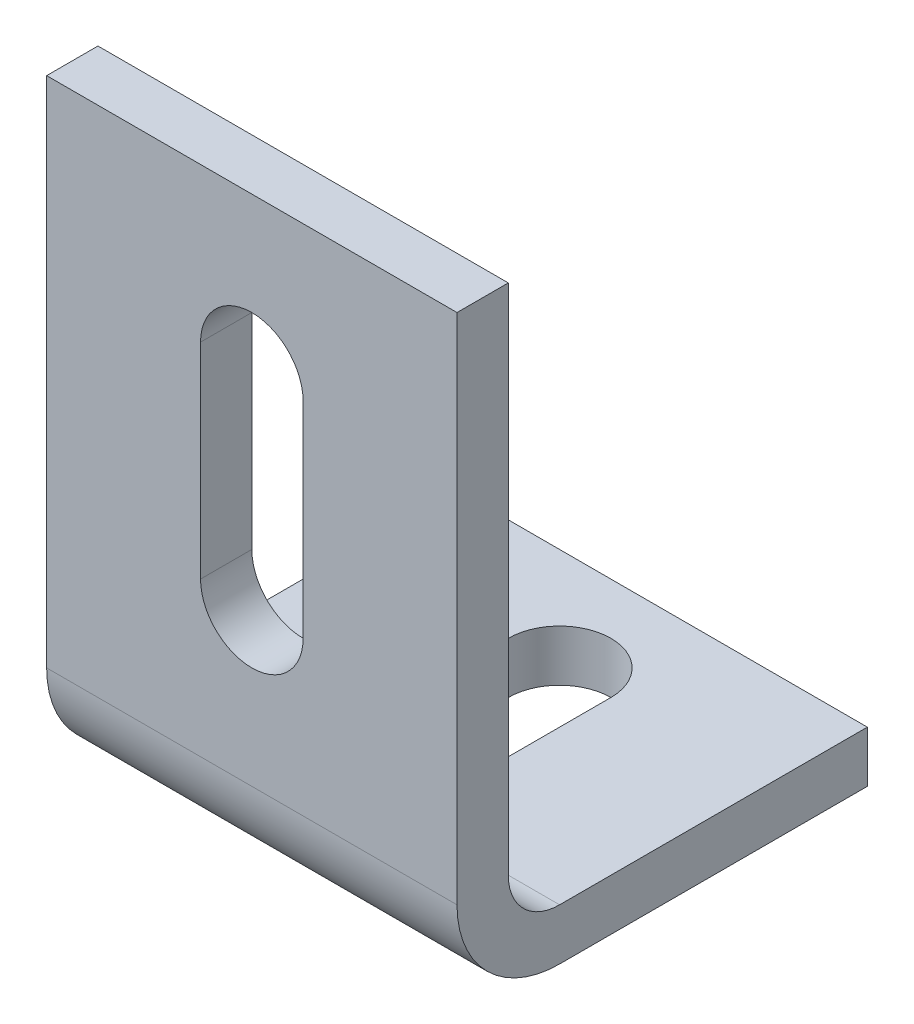
ISO-10303-21;
HEADER;
FILE_DESCRIPTION(('STEP AP214'),'2;1');
FILE_NAME('part.step','',(''),(''),'','','');
FILE_SCHEMA(('AUTOMOTIVE_DESIGN { 1 0 10303 214 1 1 1 1 }'));
ENDSEC;
DATA;
#1=APPLICATION_CONTEXT('core data for automotive mechanical design processes');
#2=APPLICATION_PROTOCOL_DEFINITION('international standard','automotive_design',2000,#1);
#3=PRODUCT_CONTEXT('',#1,'mechanical');
#4=PRODUCT('Part','Part','',(#3));
#5=PRODUCT_RELATED_PRODUCT_CATEGORY('part','',(#4));
#6=PRODUCT_DEFINITION_FORMATION('','',#4);
#7=PRODUCT_DEFINITION_CONTEXT('part definition',#1,'design');
#8=PRODUCT_DEFINITION('design','',#6,#7);
#9=PRODUCT_DEFINITION_SHAPE('','',#8);
#10=(LENGTH_UNIT() NAMED_UNIT(*) SI_UNIT(.MILLI.,.METRE.));
#11=(NAMED_UNIT(*) PLANE_ANGLE_UNIT() SI_UNIT($,.RADIAN.));
#12=(NAMED_UNIT(*) SI_UNIT($,.STERADIAN.) SOLID_ANGLE_UNIT());
#13=UNCERTAINTY_MEASURE_WITH_UNIT(LENGTH_MEASURE(1.E-05),#10,'distance_accuracy_value','');
#14=(GEOMETRIC_REPRESENTATION_CONTEXT(3) GLOBAL_UNCERTAINTY_ASSIGNED_CONTEXT((#13)) GLOBAL_UNIT_ASSIGNED_CONTEXT((#10,
#11,#12)) REPRESENTATION_CONTEXT('',''));
#15=CARTESIAN_POINT('',(0.,0.,0.));
#16=DIRECTION('',(0.,0.,1.));
#17=DIRECTION('',(1.,0.,0.));
#18=AXIS2_PLACEMENT_3D('',#15,#16,#17);
#19=CARTESIAN_POINT('',(12.7,34.925,0.));
#20=DIRECTION('',(0.,0.,-1.));
#21=DIRECTION('',(0.,1.,0.));
#22=AXIS2_PLACEMENT_3D('',#19,#20,#21);
#23=PLANE('',#22);
#24=DIRECTION('',(0.,-1.,0.));
#25=VECTOR('',#24,1.);
#26=CARTESIAN_POINT('',(-12.7,34.925,0.));
#27=LINE('',#26,#25);
#28=CARTESIAN_POINT('',(-12.7,34.925,0.));
#29=VERTEX_POINT('',#28);
#30=CARTESIAN_POINT('',(-12.7,3.175,0.));
#31=VERTEX_POINT('',#30);
#32=EDGE_CURVE('E245',#29,#31,#27,.T.);
#33=ORIENTED_EDGE('',*,*,#32,.F.);
#34=DIRECTION('',(-1.,0.,0.));
#35=VECTOR('',#34,1.);
#36=CARTESIAN_POINT('',(12.7,34.925,0.));
#37=LINE('',#36,#35);
#38=CARTESIAN_POINT('',(12.7,34.925,0.));
#39=VERTEX_POINT('',#38);
#40=EDGE_CURVE('E261',#39,#29,#37,.T.);
#41=ORIENTED_EDGE('',*,*,#40,.F.);
#42=DIRECTION('',(0.,-1.,0.));
#43=VECTOR('',#42,1.);
#44=CARTESIAN_POINT('',(12.7,34.925,0.));
#45=LINE('',#44,#43);
#46=CARTESIAN_POINT('',(12.7,3.175,0.));
#47=VERTEX_POINT('',#46);
#48=EDGE_CURVE('E223',#39,#47,#45,.T.);
#49=ORIENTED_EDGE('',*,*,#48,.T.);
#50=DIRECTION('',(-1.,0.,0.));
#51=VECTOR('',#50,1.);
#52=CARTESIAN_POINT('',(12.7,3.175,0.));
#53=LINE('',#52,#51);
#54=EDGE_CURVE('E263',#47,#31,#53,.T.);
#55=ORIENTED_EDGE('',*,*,#54,.T.);
#56=EDGE_LOOP('',(#33,#41,#49,#55));
#57=FACE_BOUND('',#56,.T.);
#58=DIRECTION('',(0.,1.,0.));
#59=VECTOR('',#58,1.);
#60=CARTESIAN_POINT('',(3.175,25.4,0.));
#61=LINE('',#60,#59);
#62=CARTESIAN_POINT('',(3.17500000000001,12.7,0.));
#63=VERTEX_POINT('',#62);
#64=CARTESIAN_POINT('',(3.175,25.4,0.));
#65=VERTEX_POINT('',#64);
#66=EDGE_CURVE('E183',#63,#65,#61,.T.);
#67=ORIENTED_EDGE('',*,*,#66,.T.);
#68=CARTESIAN_POINT('',(0.,25.4,0.));
#69=DIRECTION('',(0.,0.,1.));
#70=DIRECTION('',(1.,0.,0.));
#71=AXIS2_PLACEMENT_3D('',#68,#69,#70);
#72=CIRCLE('',#71,3.175);
#73=CARTESIAN_POINT('',(-3.175,25.4,0.));
#74=VERTEX_POINT('',#73);
#75=EDGE_CURVE('E176',#65,#74,#72,.T.);
#76=ORIENTED_EDGE('',*,*,#75,.T.);
#77=DIRECTION('',(0.,-1.,0.));
#78=VECTOR('',#77,1.);
#79=CARTESIAN_POINT('',(-3.175,25.4,0.));
#80=LINE('',#79,#78);
#81=CARTESIAN_POINT('',(-3.175,12.7,0.));
#82=VERTEX_POINT('',#81);
#83=EDGE_CURVE('E193',#74,#82,#80,.T.);
#84=ORIENTED_EDGE('',*,*,#83,.T.);
#85=CARTESIAN_POINT('',(0.,12.7,0.));
#86=DIRECTION('',(0.,0.,1.));
#87=DIRECTION('',(1.,0.,0.));
#88=AXIS2_PLACEMENT_3D('',#85,#86,#87);
#89=CIRCLE('',#88,3.175);
#90=EDGE_CURVE('E196',#82,#63,#89,.T.);
#91=ORIENTED_EDGE('',*,*,#90,.T.);
#92=EDGE_LOOP('',(#67,#76,#84,#91));
#93=FACE_BOUND('',#92,.T.);
#94=ADVANCED_FACE('F32',(#57,#93),#23,.T.);
#95=CARTESIAN_POINT('',(12.7,34.925,3.17500000000001));
#96=DIRECTION('',(0.,0.,-1.));
#97=DIRECTION('',(0.,1.,0.));
#98=AXIS2_PLACEMENT_3D('',#95,#96,#97);
#99=PLANE('',#98);
#100=DIRECTION('',(0.,-1.,0.));
#101=VECTOR('',#100,1.);
#102=CARTESIAN_POINT('',(-12.7,34.925,3.17500000000001));
#103=LINE('',#102,#101);
#104=CARTESIAN_POINT('',(-12.7,34.925,3.17500000000001));
#105=VERTEX_POINT('',#104);
#106=CARTESIAN_POINT('',(-12.7,3.175,3.175));
#107=VERTEX_POINT('',#106);
#108=EDGE_CURVE('E251',#105,#107,#103,.T.);
#109=ORIENTED_EDGE('',*,*,#108,.T.);
#110=DIRECTION('',(-1.,0.,0.));
#111=VECTOR('',#110,1.);
#112=CARTESIAN_POINT('',(12.7,3.175,3.175));
#113=LINE('',#112,#111);
#114=CARTESIAN_POINT('',(12.7,3.175,3.175));
#115=VERTEX_POINT('',#114);
#116=EDGE_CURVE('E256',#115,#107,#113,.T.);
#117=ORIENTED_EDGE('',*,*,#116,.F.);
#118=DIRECTION('',(0.,-1.,0.));
#119=VECTOR('',#118,1.);
#120=CARTESIAN_POINT('',(12.7,34.925,3.17500000000001));
#121=LINE('',#120,#119);
#122=CARTESIAN_POINT('',(12.7,34.925,3.17500000000001));
#123=VERTEX_POINT('',#122);
#124=EDGE_CURVE('E229',#123,#115,#121,.T.);
#125=ORIENTED_EDGE('',*,*,#124,.F.);
#126=DIRECTION('',(-1.,0.,0.));
#127=VECTOR('',#126,1.);
#128=CARTESIAN_POINT('',(12.7,34.925,3.17500000000001));
#129=LINE('',#128,#127);
#130=EDGE_CURVE('E259',#123,#105,#129,.T.);
#131=ORIENTED_EDGE('',*,*,#130,.T.);
#132=EDGE_LOOP('',(#109,#117,#125,#131));
#133=FACE_BOUND('',#132,.T.);
#134=CARTESIAN_POINT('',(0.,25.4,3.17500000000001));
#135=DIRECTION('',(0.,0.,1.));
#136=DIRECTION('',(1.,0.,0.));
#137=AXIS2_PLACEMENT_3D('',#134,#135,#136);
#138=CIRCLE('',#137,3.175);
#139=CARTESIAN_POINT('',(3.175,25.4,3.17500000000001));
#140=VERTEX_POINT('',#139);
#141=CARTESIAN_POINT('',(-3.175,25.4,3.17500000000001));
#142=VERTEX_POINT('',#141);
#143=EDGE_CURVE('E180',#140,#142,#138,.T.);
#144=ORIENTED_EDGE('',*,*,#143,.F.);
#145=DIRECTION('',(0.,1.,0.));
#146=VECTOR('',#145,1.);
#147=CARTESIAN_POINT('',(3.175,25.4,3.17500000000001));
#148=LINE('',#147,#146);
#149=CARTESIAN_POINT('',(3.17500000000001,12.7,3.175));
#150=VERTEX_POINT('',#149);
#151=EDGE_CURVE('E188',#150,#140,#148,.T.);
#152=ORIENTED_EDGE('',*,*,#151,.F.);
#153=CARTESIAN_POINT('',(0.,12.7,3.17500000000001));
#154=DIRECTION('',(0.,0.,1.));
#155=DIRECTION('',(1.,0.,0.));
#156=AXIS2_PLACEMENT_3D('',#153,#154,#155);
#157=CIRCLE('',#156,3.175);
#158=CARTESIAN_POINT('',(-3.175,12.7,3.17500000000001));
#159=VERTEX_POINT('',#158);
#160=EDGE_CURVE('E185',#159,#150,#157,.T.);
#161=ORIENTED_EDGE('',*,*,#160,.F.);
#162=DIRECTION('',(0.,-1.,0.));
#163=VECTOR('',#162,1.);
#164=CARTESIAN_POINT('',(-3.175,25.4,3.17500000000001));
#165=LINE('',#164,#163);
#166=EDGE_CURVE('E182',#142,#159,#165,.T.);
#167=ORIENTED_EDGE('',*,*,#166,.F.);
#168=EDGE_LOOP('',(#144,#152,#161,#167));
#169=FACE_BOUND('',#168,.T.);
#170=ADVANCED_FACE('F297',(#133,#169),#99,.F.);
#171=CARTESIAN_POINT('',(12.7,-3.175,-3.175));
#172=DIRECTION('',(0.,1.,0.));
#173=DIRECTION('',(0.,0.,1.));
#174=AXIS2_PLACEMENT_3D('',#171,#172,#173);
#175=PLANE('',#174);
#176=DIRECTION('',(0.,0.,-1.));
#177=VECTOR('',#176,1.);
#178=CARTESIAN_POINT('',(3.175,-3.175,-15.875));
#179=LINE('',#178,#177);
#180=CARTESIAN_POINT('',(3.175,-3.175,-9.52499999999999));
#181=VERTEX_POINT('',#180);
#182=CARTESIAN_POINT('',(3.175,-3.175,-15.875));
#183=VERTEX_POINT('',#182);
#184=EDGE_CURVE('E152',#181,#183,#179,.T.);
#185=ORIENTED_EDGE('',*,*,#184,.T.);
#186=CARTESIAN_POINT('',(0.,-3.175,-15.875));
#187=DIRECTION('',(0.,1.,0.));
#188=DIRECTION('',(0.,0.,1.));
#189=AXIS2_PLACEMENT_3D('',#186,#187,#188);
#190=CIRCLE('',#189,3.175);
#191=CARTESIAN_POINT('',(-3.175,-3.175,-15.875));
#192=VERTEX_POINT('',#191);
#193=EDGE_CURVE('E146',#183,#192,#190,.T.);
#194=ORIENTED_EDGE('',*,*,#193,.T.);
#195=DIRECTION('',(0.,0.,1.));
#196=VECTOR('',#195,1.);
#197=CARTESIAN_POINT('',(-3.175,-3.175,-15.875));
#198=LINE('',#197,#196);
#199=CARTESIAN_POINT('',(-3.175,-3.175,-9.52499999999999));
#200=VERTEX_POINT('',#199);
#201=EDGE_CURVE('E155',#192,#200,#198,.T.);
#202=ORIENTED_EDGE('',*,*,#201,.T.);
#203=CARTESIAN_POINT('',(0.,-3.175,-9.52499999999999));
#204=DIRECTION('',(0.,1.,0.));
#205=DIRECTION('',(0.,0.,1.));
#206=AXIS2_PLACEMENT_3D('',#203,#204,#205);
#207=CIRCLE('',#206,3.175);
#208=EDGE_CURVE('E47',#200,#181,#207,.T.);
#209=ORIENTED_EDGE('',*,*,#208,.T.);
#210=EDGE_LOOP('',(#185,#194,#202,#209));
#211=FACE_BOUND('',#210,.T.);
#212=DIRECTION('',(0.,0.,-1.));
#213=VECTOR('',#212,1.);
#214=CARTESIAN_POINT('',(-12.7,-3.175,-3.175));
#215=LINE('',#214,#213);
#216=CARTESIAN_POINT('',(-12.7,-3.175,-3.175));
#217=VERTEX_POINT('',#216);
#218=CARTESIAN_POINT('',(-12.7,-3.175,-22.225));
#219=VERTEX_POINT('',#218);
#220=EDGE_CURVE('E210',#217,#219,#215,.T.);
#221=ORIENTED_EDGE('',*,*,#220,.T.);
#222=DIRECTION('',(-1.,0.,0.));
#223=VECTOR('',#222,1.);
#224=CARTESIAN_POINT('',(12.7,-3.175,-22.225));
#225=LINE('',#224,#223);
#226=CARTESIAN_POINT('',(12.7,-3.175,-22.225));
#227=VERTEX_POINT('',#226);
#228=EDGE_CURVE('E11',#227,#219,#225,.T.);
#229=ORIENTED_EDGE('',*,*,#228,.F.);
#230=DIRECTION('',(0.,0.,-1.));
#231=VECTOR('',#230,1.);
#232=CARTESIAN_POINT('',(12.7,-3.175,-3.175));
#233=LINE('',#232,#231);
#234=CARTESIAN_POINT('',(12.7,-3.175,-3.175));
#235=VERTEX_POINT('',#234);
#236=EDGE_CURVE('E211',#235,#227,#233,.T.);
#237=ORIENTED_EDGE('',*,*,#236,.F.);
#238=DIRECTION('',(-1.,0.,0.));
#239=VECTOR('',#238,1.);
#240=CARTESIAN_POINT('',(12.7,-3.175,-3.175));
#241=LINE('',#240,#239);
#242=EDGE_CURVE('E233',#235,#217,#241,.T.);
#243=ORIENTED_EDGE('',*,*,#242,.T.);
#244=EDGE_LOOP('',(#221,#229,#237,#243));
#245=FACE_BOUND('',#244,.T.);
#246=ADVANCED_FACE('F34',(#211,#245),#175,.F.);
#247=CARTESIAN_POINT('',(12.7,0.,-22.225));
#248=DIRECTION('',(0.,0.,-1.));
#249=DIRECTION('',(-1.,0.,0.));
#250=AXIS2_PLACEMENT_3D('',#247,#248,#249);
#251=PLANE('',#250);
#252=DIRECTION('',(0.,-1.,0.));
#253=VECTOR('',#252,1.);
#254=CARTESIAN_POINT('',(-12.7,0.,-22.225));
#255=LINE('',#254,#253);
#256=CARTESIAN_POINT('',(-12.7,0.,-22.225));
#257=VERTEX_POINT('',#256);
#258=EDGE_CURVE('E236',#257,#219,#255,.T.);
#259=ORIENTED_EDGE('',*,*,#258,.F.);
#260=DIRECTION('',(-1.,0.,0.));
#261=VECTOR('',#260,1.);
#262=CARTESIAN_POINT('',(12.7,0.,-22.225));
#263=LINE('',#262,#261);
#264=CARTESIAN_POINT('',(12.7,0.,-22.225));
#265=VERTEX_POINT('',#264);
#266=EDGE_CURVE('E40',#265,#257,#263,.T.);
#267=ORIENTED_EDGE('',*,*,#266,.F.);
#268=DIRECTION('',(0.,-1.,0.));
#269=VECTOR('',#268,1.);
#270=CARTESIAN_POINT('',(12.7,0.,-22.225));
#271=LINE('',#270,#269);
#272=EDGE_CURVE('E213',#265,#227,#271,.T.);
#273=ORIENTED_EDGE('',*,*,#272,.T.);
#274=ORIENTED_EDGE('',*,*,#228,.T.);
#275=EDGE_LOOP('',(#259,#267,#273,#274));
#276=FACE_BOUND('',#275,.T.);
#277=ADVANCED_FACE('F273',(#276),#251,.T.);
#278=CARTESIAN_POINT('',(12.7,0.,-3.175));
#279=DIRECTION('',(0.,1.,0.));
#280=DIRECTION('',(0.,0.,1.));
#281=AXIS2_PLACEMENT_3D('',#278,#279,#280);
#282=PLANE('',#281);
#283=CARTESIAN_POINT('',(0.,0.,-15.875));
#284=DIRECTION('',(0.,1.,0.));
#285=DIRECTION('',(0.,0.,1.));
#286=AXIS2_PLACEMENT_3D('',#283,#284,#285);
#287=CIRCLE('',#286,3.175);
#288=CARTESIAN_POINT('',(3.175,0.,-15.875));
#289=VERTEX_POINT('',#288);
#290=CARTESIAN_POINT('',(-3.175,0.,-15.875));
#291=VERTEX_POINT('',#290);
#292=EDGE_CURVE('E55',#289,#291,#287,.T.);
#293=ORIENTED_EDGE('',*,*,#292,.F.);
#294=DIRECTION('',(0.,0.,-1.));
#295=VECTOR('',#294,1.);
#296=CARTESIAN_POINT('',(3.175,0.,-15.875));
#297=LINE('',#296,#295);
#298=CARTESIAN_POINT('',(3.175,0.,-9.52499999999999));
#299=VERTEX_POINT('',#298);
#300=EDGE_CURVE('E161',#299,#289,#297,.T.);
#301=ORIENTED_EDGE('',*,*,#300,.F.);
#302=CARTESIAN_POINT('',(0.,0.,-9.52499999999999));
#303=DIRECTION('',(0.,1.,0.));
#304=DIRECTION('',(0.,0.,1.));
#305=AXIS2_PLACEMENT_3D('',#302,#303,#304);
#306=CIRCLE('',#305,3.175);
#307=CARTESIAN_POINT('',(-3.17499999999999,0.,-9.52499999999999));
#308=VERTEX_POINT('',#307);
#309=EDGE_CURVE('E164',#308,#299,#306,.T.);
#310=ORIENTED_EDGE('',*,*,#309,.F.);
#311=DIRECTION('',(0.,0.,1.));
#312=VECTOR('',#311,1.);
#313=CARTESIAN_POINT('',(-3.175,0.,-15.875));
#314=LINE('',#313,#312);
#315=EDGE_CURVE('E170',#291,#308,#314,.T.);
#316=ORIENTED_EDGE('',*,*,#315,.F.);
#317=EDGE_LOOP('',(#293,#301,#310,#316));
#318=FACE_BOUND('',#317,.T.);
#319=DIRECTION('',(0.,0.,-1.));
#320=VECTOR('',#319,1.);
#321=CARTESIAN_POINT('',(-12.7,0.,-3.175));
#322=LINE('',#321,#320);
#323=CARTESIAN_POINT('',(-12.7,0.,-3.175));
#324=VERTEX_POINT('',#323);
#325=EDGE_CURVE('E239',#324,#257,#322,.T.);
#326=ORIENTED_EDGE('',*,*,#325,.F.);
#327=DIRECTION('',(-1.,0.,0.));
#328=VECTOR('',#327,1.);
#329=CARTESIAN_POINT('',(12.7,0.,-3.175));
#330=LINE('',#329,#328);
#331=CARTESIAN_POINT('',(12.7,0.,-3.175));
#332=VERTEX_POINT('',#331);
#333=EDGE_CURVE('E265',#332,#324,#330,.T.);
#334=ORIENTED_EDGE('',*,*,#333,.F.);
#335=DIRECTION('',(0.,0.,-1.));
#336=VECTOR('',#335,1.);
#337=CARTESIAN_POINT('',(12.7,0.,-3.175));
#338=LINE('',#337,#336);
#339=EDGE_CURVE('E217',#332,#265,#338,.T.);
#340=ORIENTED_EDGE('',*,*,#339,.T.);
#341=ORIENTED_EDGE('',*,*,#266,.T.);
#342=EDGE_LOOP('',(#326,#334,#340,#341));
#343=FACE_BOUND('',#342,.T.);
#344=ADVANCED_FACE('F269',(#318,#343),#282,.T.);
#345=CARTESIAN_POINT('',(12.7,3.175,-3.175));
#346=DIRECTION('',(-1.,0.,0.));
#347=DIRECTION('',(0.,0.,1.));
#348=AXIS2_PLACEMENT_3D('',#345,#346,#347);
#349=CYLINDRICAL_SURFACE('',#348,3.175);
#350=CARTESIAN_POINT('',(-12.7,3.175,-3.175));
#351=DIRECTION('',(1.,0.,0.));
#352=DIRECTION('',(0.,0.,-1.));
#353=AXIS2_PLACEMENT_3D('',#350,#351,#352);
#354=CIRCLE('',#353,3.175);
#355=EDGE_CURVE('E242',#31,#324,#354,.T.);
#356=ORIENTED_EDGE('',*,*,#355,.F.);
#357=ORIENTED_EDGE('',*,*,#54,.F.);
#358=CARTESIAN_POINT('',(12.7,3.175,-3.175));
#359=DIRECTION('',(1.,0.,0.));
#360=DIRECTION('',(0.,0.,-1.));
#361=AXIS2_PLACEMENT_3D('',#358,#359,#360);
#362=CIRCLE('',#361,3.175);
#363=EDGE_CURVE('E220',#47,#332,#362,.T.);
#364=ORIENTED_EDGE('',*,*,#363,.T.);
#365=ORIENTED_EDGE('',*,*,#333,.T.);
#366=EDGE_LOOP('',(#356,#357,#364,#365));
#367=FACE_BOUND('',#366,.T.);
#368=ADVANCED_FACE('F281',(#367),#349,.F.);
#369=CARTESIAN_POINT('',(12.7,34.925,3.17500000000001));
#370=DIRECTION('',(0.,1.,0.));
#371=DIRECTION('',(0.,0.,1.));
#372=AXIS2_PLACEMENT_3D('',#369,#370,#371);
#373=PLANE('',#372);
#374=DIRECTION('',(0.,0.,-1.));
#375=VECTOR('',#374,1.);
#376=CARTESIAN_POINT('',(-12.7,34.925,3.17500000000001));
#377=LINE('',#376,#375);
#378=EDGE_CURVE('E248',#105,#29,#377,.T.);
#379=ORIENTED_EDGE('',*,*,#378,.F.);
#380=ORIENTED_EDGE('',*,*,#130,.F.);
#381=DIRECTION('',(0.,0.,-1.));
#382=VECTOR('',#381,1.);
#383=CARTESIAN_POINT('',(12.7,34.925,3.17500000000001));
#384=LINE('',#383,#382);
#385=EDGE_CURVE('E226',#123,#39,#384,.T.);
#386=ORIENTED_EDGE('',*,*,#385,.T.);
#387=ORIENTED_EDGE('',*,*,#40,.T.);
#388=EDGE_LOOP('',(#379,#380,#386,#387));
#389=FACE_BOUND('',#388,.T.);
#390=ADVANCED_FACE('F301',(#389),#373,.T.);
#391=CARTESIAN_POINT('',(12.7,3.175,-3.175));
#392=DIRECTION('',(-1.,0.,0.));
#393=DIRECTION('',(0.,0.,1.));
#394=AXIS2_PLACEMENT_3D('',#391,#392,#393);
#395=CYLINDRICAL_SURFACE('',#394,6.35);
#396=CARTESIAN_POINT('',(-12.7,3.175,-3.175));
#397=DIRECTION('',(1.,0.,0.));
#398=DIRECTION('',(0.,0.,-1.));
#399=AXIS2_PLACEMENT_3D('',#396,#397,#398);
#400=CIRCLE('',#399,6.35);
#401=EDGE_CURVE('E214',#107,#217,#400,.T.);
#402=ORIENTED_EDGE('',*,*,#401,.T.);
#403=ORIENTED_EDGE('',*,*,#242,.F.);
#404=CARTESIAN_POINT('',(12.7,3.175,-3.175));
#405=DIRECTION('',(1.,0.,0.));
#406=DIRECTION('',(0.,0.,-1.));
#407=AXIS2_PLACEMENT_3D('',#404,#405,#406);
#408=CIRCLE('',#407,6.35);
#409=EDGE_CURVE('E231',#115,#235,#408,.T.);
#410=ORIENTED_EDGE('',*,*,#409,.F.);
#411=ORIENTED_EDGE('',*,*,#116,.T.);
#412=EDGE_LOOP('',(#402,#403,#410,#411));
#413=FACE_BOUND('',#412,.T.);
#414=ADVANCED_FACE('F293',(#413),#395,.T.);
#415=CARTESIAN_POINT('',(12.7,3.175,-3.175));
#416=DIRECTION('',(1.,0.,0.));
#417=DIRECTION('',(0.,0.,-1.));
#418=AXIS2_PLACEMENT_3D('',#415,#416,#417);
#419=PLANE('',#418);
#420=ORIENTED_EDGE('',*,*,#236,.T.);
#421=ORIENTED_EDGE('',*,*,#272,.F.);
#422=ORIENTED_EDGE('',*,*,#339,.F.);
#423=ORIENTED_EDGE('',*,*,#363,.F.);
#424=ORIENTED_EDGE('',*,*,#48,.F.);
#425=ORIENTED_EDGE('',*,*,#385,.F.);
#426=ORIENTED_EDGE('',*,*,#124,.T.);
#427=ORIENTED_EDGE('',*,*,#409,.T.);
#428=EDGE_LOOP('',(#420,#421,#422,#423,#424,#425,#426,#427));
#429=FACE_BOUND('',#428,.T.);
#430=ADVANCED_FACE('F284',(#429),#419,.T.);
#431=CARTESIAN_POINT('',(-12.7,3.175,-3.175));
#432=DIRECTION('',(1.,0.,0.));
#433=DIRECTION('',(0.,0.,-1.));
#434=AXIS2_PLACEMENT_3D('',#431,#432,#433);
#435=PLANE('',#434);
#436=ORIENTED_EDGE('',*,*,#220,.F.);
#437=ORIENTED_EDGE('',*,*,#401,.F.);
#438=ORIENTED_EDGE('',*,*,#108,.F.);
#439=ORIENTED_EDGE('',*,*,#378,.T.);
#440=ORIENTED_EDGE('',*,*,#32,.T.);
#441=ORIENTED_EDGE('',*,*,#355,.T.);
#442=ORIENTED_EDGE('',*,*,#325,.T.);
#443=ORIENTED_EDGE('',*,*,#258,.T.);
#444=EDGE_LOOP('',(#436,#437,#438,#439,#440,#441,#442,#443));
#445=FACE_BOUND('',#444,.T.);
#446=ADVANCED_FACE('F277',(#445),#435,.F.);
#447=CARTESIAN_POINT('',(0.,25.4,3.17500000000001));
#448=DIRECTION('',(0.,0.,-1.));
#449=DIRECTION('',(-1.,0.,0.));
#450=AXIS2_PLACEMENT_3D('',#447,#448,#449);
#451=CYLINDRICAL_SURFACE('',#450,3.175);
#452=ORIENTED_EDGE('',*,*,#75,.F.);
#453=DIRECTION('',(0.,0.,-1.));
#454=VECTOR('',#453,1.);
#455=CARTESIAN_POINT('',(3.175,25.4,3.17500000000001));
#456=LINE('',#455,#454);
#457=EDGE_CURVE('E190',#140,#65,#456,.T.);
#458=ORIENTED_EDGE('',*,*,#457,.F.);
#459=ORIENTED_EDGE('',*,*,#143,.T.);
#460=DIRECTION('',(0.,0.,-1.));
#461=VECTOR('',#460,1.);
#462=CARTESIAN_POINT('',(-3.175,25.4,3.17500000000001));
#463=LINE('',#462,#461);
#464=EDGE_CURVE('E207',#142,#74,#463,.T.);
#465=ORIENTED_EDGE('',*,*,#464,.T.);
#466=EDGE_LOOP('',(#452,#458,#459,#465));
#467=FACE_BOUND('',#466,.T.);
#468=ADVANCED_FACE('F314',(#467),#451,.F.);
#469=CARTESIAN_POINT('',(-3.175,25.4,3.17500000000001));
#470=DIRECTION('',(1.,0.,0.));
#471=DIRECTION('',(0.,1.,0.));
#472=AXIS2_PLACEMENT_3D('',#469,#470,#471);
#473=PLANE('',#472);
#474=ORIENTED_EDGE('',*,*,#83,.F.);
#475=ORIENTED_EDGE('',*,*,#464,.F.);
#476=ORIENTED_EDGE('',*,*,#166,.T.);
#477=DIRECTION('',(0.,0.,-1.));
#478=VECTOR('',#477,1.);
#479=CARTESIAN_POINT('',(-3.175,12.7,3.17500000000001));
#480=LINE('',#479,#478);
#481=EDGE_CURVE('E205',#159,#82,#480,.T.);
#482=ORIENTED_EDGE('',*,*,#481,.T.);
#483=EDGE_LOOP('',(#474,#475,#476,#482));
#484=FACE_BOUND('',#483,.T.);
#485=ADVANCED_FACE('F320',(#484),#473,.T.);
#486=CARTESIAN_POINT('',(0.,12.7,3.17500000000001));
#487=DIRECTION('',(0.,0.,-1.));
#488=DIRECTION('',(-1.,0.,0.));
#489=AXIS2_PLACEMENT_3D('',#486,#487,#488);
#490=CYLINDRICAL_SURFACE('',#489,3.175);
#491=ORIENTED_EDGE('',*,*,#90,.F.);
#492=ORIENTED_EDGE('',*,*,#481,.F.);
#493=ORIENTED_EDGE('',*,*,#160,.T.);
#494=DIRECTION('',(0.,0.,-1.));
#495=VECTOR('',#494,1.);
#496=CARTESIAN_POINT('',(3.17500000000001,12.7,3.17500000000001));
#497=LINE('',#496,#495);
#498=EDGE_CURVE('E203',#150,#63,#497,.T.);
#499=ORIENTED_EDGE('',*,*,#498,.T.);
#500=EDGE_LOOP('',(#491,#492,#493,#499));
#501=FACE_BOUND('',#500,.T.);
#502=ADVANCED_FACE('F322',(#501),#490,.F.);
#503=CARTESIAN_POINT('',(3.175,25.4,3.17500000000001));
#504=DIRECTION('',(-1.,0.,0.));
#505=DIRECTION('',(0.,-1.,0.));
#506=AXIS2_PLACEMENT_3D('',#503,#504,#505);
#507=PLANE('',#506);
#508=ORIENTED_EDGE('',*,*,#66,.F.);
#509=ORIENTED_EDGE('',*,*,#498,.F.);
#510=ORIENTED_EDGE('',*,*,#151,.T.);
#511=ORIENTED_EDGE('',*,*,#457,.T.);
#512=EDGE_LOOP('',(#508,#509,#510,#511));
#513=FACE_BOUND('',#512,.T.);
#514=ADVANCED_FACE('F309',(#513),#507,.T.);
#515=CARTESIAN_POINT('',(0.,-3.175,-15.875));
#516=DIRECTION('',(0.,1.,0.));
#517=DIRECTION('',(0.,0.,1.));
#518=AXIS2_PLACEMENT_3D('',#515,#516,#517);
#519=CYLINDRICAL_SURFACE('',#518,3.175);
#520=ORIENTED_EDGE('',*,*,#292,.T.);
#521=DIRECTION('',(0.,1.,0.));
#522=VECTOR('',#521,1.);
#523=CARTESIAN_POINT('',(-3.175,-3.175,-15.875));
#524=LINE('',#523,#522);
#525=EDGE_CURVE('E142',#192,#291,#524,.T.);
#526=ORIENTED_EDGE('',*,*,#525,.F.);
#527=ORIENTED_EDGE('',*,*,#193,.F.);
#528=DIRECTION('',(0.,1.,0.));
#529=VECTOR('',#528,1.);
#530=CARTESIAN_POINT('',(3.175,-3.175,-15.875));
#531=LINE('',#530,#529);
#532=EDGE_CURVE('E174',#183,#289,#531,.T.);
#533=ORIENTED_EDGE('',*,*,#532,.T.);
#534=EDGE_LOOP('',(#520,#526,#527,#533));
#535=FACE_BOUND('',#534,.T.);
#536=ADVANCED_FACE('F144',(#535),#519,.F.);
#537=CARTESIAN_POINT('',(3.175,-3.175,-15.875));
#538=DIRECTION('',(1.,0.,0.));
#539=DIRECTION('',(0.,0.,-1.));
#540=AXIS2_PLACEMENT_3D('',#537,#538,#539);
#541=PLANE('',#540);
#542=ORIENTED_EDGE('',*,*,#300,.T.);
#543=ORIENTED_EDGE('',*,*,#532,.F.);
#544=ORIENTED_EDGE('',*,*,#184,.F.);
#545=DIRECTION('',(0.,1.,0.));
#546=VECTOR('',#545,1.);
#547=CARTESIAN_POINT('',(3.175,-3.175,-9.52499999999999));
#548=LINE('',#547,#546);
#549=EDGE_CURVE('E177',#181,#299,#548,.T.);
#550=ORIENTED_EDGE('',*,*,#549,.T.);
#551=EDGE_LOOP('',(#542,#543,#544,#550));
#552=FACE_BOUND('',#551,.T.);
#553=ADVANCED_FACE('F417',(#552),#541,.F.);
#554=CARTESIAN_POINT('',(0.,-3.175,-9.52499999999999));
#555=DIRECTION('',(0.,1.,0.));
#556=DIRECTION('',(0.,0.,1.));
#557=AXIS2_PLACEMENT_3D('',#554,#555,#556);
#558=CYLINDRICAL_SURFACE('',#557,3.175);
#559=ORIENTED_EDGE('',*,*,#309,.T.);
#560=ORIENTED_EDGE('',*,*,#549,.F.);
#561=ORIENTED_EDGE('',*,*,#208,.F.);
#562=DIRECTION('',(0.,1.,0.));
#563=VECTOR('',#562,1.);
#564=CARTESIAN_POINT('',(-3.17499999999999,-3.175,-9.52499999999999));
#565=LINE('',#564,#563);
#566=EDGE_CURVE('E151',#200,#308,#565,.T.);
#567=ORIENTED_EDGE('',*,*,#566,.T.);
#568=EDGE_LOOP('',(#559,#560,#561,#567));
#569=FACE_BOUND('',#568,.T.);
#570=ADVANCED_FACE('F426',(#569),#558,.F.);
#571=CARTESIAN_POINT('',(-3.175,-3.175,-15.875));
#572=DIRECTION('',(-1.,0.,0.));
#573=DIRECTION('',(0.,0.,1.));
#574=AXIS2_PLACEMENT_3D('',#571,#572,#573);
#575=PLANE('',#574);
#576=ORIENTED_EDGE('',*,*,#315,.T.);
#577=ORIENTED_EDGE('',*,*,#566,.F.);
#578=ORIENTED_EDGE('',*,*,#201,.F.);
#579=ORIENTED_EDGE('',*,*,#525,.T.);
#580=EDGE_LOOP('',(#576,#577,#578,#579));
#581=FACE_BOUND('',#580,.T.);
#582=ADVANCED_FACE('F156',(#581),#575,.F.);
#583=CLOSED_SHELL('',(#94,#170,#246,#277,#344,#368,#390,#414,#430,#446,#468,#485,#502,#514,#536,
#553,#570,#582));
#584=MANIFOLD_SOLID_BREP('B2',#583);
#585=ADVANCED_BREP_SHAPE_REPRESENTATION('',(#18,#584),#14);
#586=SHAPE_DEFINITION_REPRESENTATION(#9,#585);
ENDSEC;
END-ISO-10303-21;
